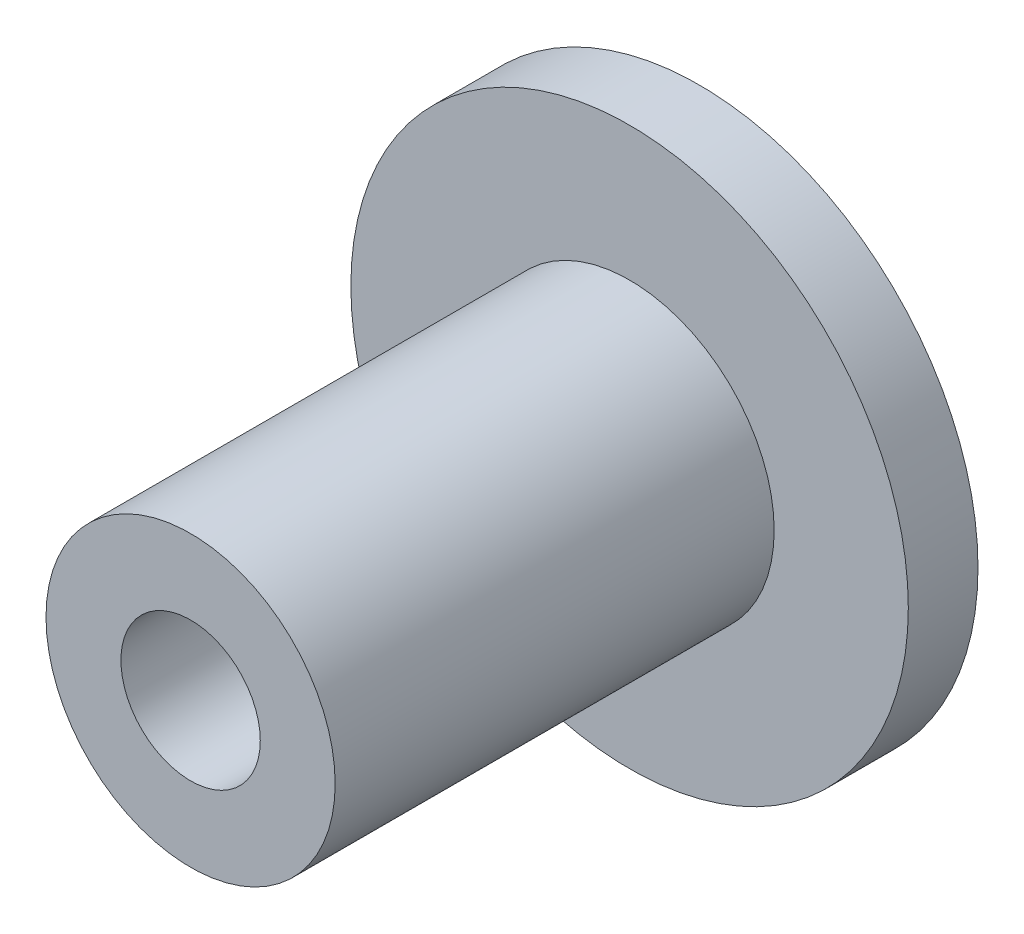
ISO-10303-21;
HEADER;
FILE_DESCRIPTION(('STEP AP214'),'2;1');
FILE_NAME('part.step','',(''),(''),'','','');
FILE_SCHEMA(('AUTOMOTIVE_DESIGN { 1 0 10303 214 1 1 1 1 }'));
ENDSEC;
DATA;
#1=APPLICATION_CONTEXT('core data for automotive mechanical design processes');
#2=APPLICATION_PROTOCOL_DEFINITION('international standard','automotive_design',2000,#1);
#3=PRODUCT_CONTEXT('',#1,'mechanical');
#4=PRODUCT('Part','Part','',(#3));
#5=PRODUCT_RELATED_PRODUCT_CATEGORY('part','',(#4));
#6=PRODUCT_DEFINITION_FORMATION('','',#4);
#7=PRODUCT_DEFINITION_CONTEXT('part definition',#1,'design');
#8=PRODUCT_DEFINITION('design','',#6,#7);
#9=PRODUCT_DEFINITION_SHAPE('','',#8);
#10=(LENGTH_UNIT() NAMED_UNIT(*) SI_UNIT(.MILLI.,.METRE.));
#11=(NAMED_UNIT(*) PLANE_ANGLE_UNIT() SI_UNIT($,.RADIAN.));
#12=(NAMED_UNIT(*) SI_UNIT($,.STERADIAN.) SOLID_ANGLE_UNIT());
#13=UNCERTAINTY_MEASURE_WITH_UNIT(LENGTH_MEASURE(1.E-05),#10,'distance_accuracy_value','');
#14=(GEOMETRIC_REPRESENTATION_CONTEXT(3) GLOBAL_UNCERTAINTY_ASSIGNED_CONTEXT((#13)) GLOBAL_UNIT_ASSIGNED_CONTEXT((#10,
#11,#12)) REPRESENTATION_CONTEXT('',''));
#15=CARTESIAN_POINT('',(0.,0.,0.));
#16=DIRECTION('',(0.,0.,1.));
#17=DIRECTION('',(1.,0.,0.));
#18=AXIS2_PLACEMENT_3D('',#15,#16,#17);
#19=CARTESIAN_POINT('',(0.,0.,0.5));
#20=DIRECTION('',(0.,0.,-1.));
#21=DIRECTION('',(-1.,0.,0.));
#22=AXIS2_PLACEMENT_3D('',#19,#20,#21);
#23=CYLINDRICAL_SURFACE('',#22,4.);
#24=CARTESIAN_POINT('',(0.,0.,0.5));
#25=DIRECTION('',(0.,0.,1.));
#26=DIRECTION('',(1.,0.,0.));
#27=AXIS2_PLACEMENT_3D('',#24,#25,#26);
#28=CIRCLE('',#27,4.);
#29=CARTESIAN_POINT('',(4.,0.,0.5));
#30=VERTEX_POINT('',#29);
#31=EDGE_CURVE('E48',#30,#30,#28,.T.);
#32=ORIENTED_EDGE('',*,*,#31,.F.);
#33=EDGE_LOOP('',(#32));
#34=FACE_BOUND('',#33,.T.);
#35=CARTESIAN_POINT('',(0.,0.,-0.5));
#36=DIRECTION('',(0.,0.,1.));
#37=DIRECTION('',(1.,0.,0.));
#38=AXIS2_PLACEMENT_3D('',#35,#36,#37);
#39=CIRCLE('',#38,4.);
#40=CARTESIAN_POINT('',(4.,0.,-0.5));
#41=VERTEX_POINT('',#40);
#42=EDGE_CURVE('E44',#41,#41,#39,.T.);
#43=ORIENTED_EDGE('',*,*,#42,.T.);
#44=EDGE_LOOP('',(#43));
#45=FACE_BOUND('',#44,.T.);
#46=ADVANCED_FACE('F41',(#34,#45),#23,.T.);
#47=CARTESIAN_POINT('',(0.,0.,0.5));
#48=DIRECTION('',(0.,0.,1.));
#49=DIRECTION('',(1.,0.,0.));
#50=AXIS2_PLACEMENT_3D('',#47,#48,#49);
#51=PLANE('',#50);
#52=CARTESIAN_POINT('',(0.,0.,0.5));
#53=DIRECTION('',(0.,0.,1.));
#54=DIRECTION('',(1.,0.,0.));
#55=AXIS2_PLACEMENT_3D('',#52,#53,#54);
#56=CIRCLE('',#55,2.075);
#57=CARTESIAN_POINT('',(2.075,0.,0.5));
#58=VERTEX_POINT('',#57);
#59=EDGE_CURVE('E10',#58,#58,#56,.T.);
#60=ORIENTED_EDGE('',*,*,#59,.F.);
#61=EDGE_LOOP('',(#60));
#62=FACE_BOUND('',#61,.T.);
#63=ORIENTED_EDGE('',*,*,#31,.T.);
#64=EDGE_LOOP('',(#63));
#65=FACE_BOUND('',#64,.T.);
#66=ADVANCED_FACE('F86',(#62,#65),#51,.T.);
#67=CARTESIAN_POINT('',(0.,0.,-0.5));
#68=DIRECTION('',(0.,0.,1.));
#69=DIRECTION('',(1.,0.,0.));
#70=AXIS2_PLACEMENT_3D('',#67,#68,#69);
#71=PLANE('',#70);
#72=CARTESIAN_POINT('',(0.,0.,-0.5));
#73=DIRECTION('',(0.,0.,1.));
#74=DIRECTION('',(1.,0.,0.));
#75=AXIS2_PLACEMENT_3D('',#72,#73,#74);
#76=CIRCLE('',#75,1.);
#77=CARTESIAN_POINT('',(1.,0.,-0.500000000000001));
#78=VERTEX_POINT('',#77);
#79=EDGE_CURVE('E57',#78,#78,#76,.T.);
#80=ORIENTED_EDGE('',*,*,#79,.T.);
#81=EDGE_LOOP('',(#80));
#82=FACE_BOUND('',#81,.T.);
#83=ORIENTED_EDGE('',*,*,#42,.F.);
#84=EDGE_LOOP('',(#83));
#85=FACE_BOUND('',#84,.T.);
#86=ADVANCED_FACE('F64',(#82,#85),#71,.F.);
#87=CARTESIAN_POINT('',(0.,0.,6.8));
#88=DIRECTION('',(0.,0.,-1.));
#89=DIRECTION('',(-1.,0.,0.));
#90=AXIS2_PLACEMENT_3D('',#87,#88,#89);
#91=CYLINDRICAL_SURFACE('',#90,2.075);
#92=CARTESIAN_POINT('',(0.,0.,6.8));
#93=DIRECTION('',(0.,0.,1.));
#94=DIRECTION('',(1.,0.,0.));
#95=AXIS2_PLACEMENT_3D('',#92,#93,#94);
#96=CIRCLE('',#95,2.075);
#97=CARTESIAN_POINT('',(2.075,0.,6.8));
#98=VERTEX_POINT('',#97);
#99=EDGE_CURVE('E54',#98,#98,#96,.T.);
#100=ORIENTED_EDGE('',*,*,#99,.F.);
#101=EDGE_LOOP('',(#100));
#102=FACE_BOUND('',#101,.T.);
#103=ORIENTED_EDGE('',*,*,#59,.T.);
#104=EDGE_LOOP('',(#103));
#105=FACE_BOUND('',#104,.T.);
#106=ADVANCED_FACE('F76',(#102,#105),#91,.T.);
#107=CARTESIAN_POINT('',(0.,0.,6.8));
#108=DIRECTION('',(0.,0.,1.));
#109=DIRECTION('',(1.,0.,0.));
#110=AXIS2_PLACEMENT_3D('',#107,#108,#109);
#111=PLANE('',#110);
#112=CARTESIAN_POINT('',(0.,0.,6.8));
#113=DIRECTION('',(0.,0.,1.));
#114=DIRECTION('',(1.,0.,0.));
#115=AXIS2_PLACEMENT_3D('',#112,#113,#114);
#116=CIRCLE('',#115,1.);
#117=CARTESIAN_POINT('',(1.,0.,6.8));
#118=VERTEX_POINT('',#117);
#119=EDGE_CURVE('E58',#118,#118,#116,.T.);
#120=ORIENTED_EDGE('',*,*,#119,.F.);
#121=EDGE_LOOP('',(#120));
#122=FACE_BOUND('',#121,.T.);
#123=ORIENTED_EDGE('',*,*,#99,.T.);
#124=EDGE_LOOP('',(#123));
#125=FACE_BOUND('',#124,.T.);
#126=ADVANCED_FACE('F70',(#122,#125),#111,.T.);
#127=CARTESIAN_POINT('',(0.,0.,-0.5));
#128=DIRECTION('',(0.,0.,1.));
#129=DIRECTION('',(1.,0.,0.));
#130=AXIS2_PLACEMENT_3D('',#127,#128,#129);
#131=CYLINDRICAL_SURFACE('',#130,1.);
#132=CARTESIAN_POINT('',(1.,0.,-0.500000000000001));
#133=CARTESIAN_POINT('',(1.,0.,-0.423958333333334));
#134=CARTESIAN_POINT('',(1.,0.,-0.347916666666667));
#135=CARTESIAN_POINT('',(1.,0.,-0.195833333333334));
#136=CARTESIAN_POINT('',(1.,0.,-0.119791666666667));
#137=CARTESIAN_POINT('',(1.,0.,0.0322916666666661));
#138=CARTESIAN_POINT('',(1.,0.,0.108333333333333));
#139=CARTESIAN_POINT('',(1.,0.,0.260416666666666));
#140=CARTESIAN_POINT('',(1.,0.,0.336458333333333));
#141=CARTESIAN_POINT('',(1.,0.,0.488541666666666));
#142=CARTESIAN_POINT('',(1.,0.,0.564583333333333));
#143=CARTESIAN_POINT('',(1.,0.,0.716666666666666));
#144=CARTESIAN_POINT('',(1.,0.,0.792708333333333));
#145=CARTESIAN_POINT('',(1.,0.,0.944791666666666));
#146=CARTESIAN_POINT('',(1.,0.,1.02083333333333));
#147=CARTESIAN_POINT('',(1.,0.,1.17291666666667));
#148=CARTESIAN_POINT('',(1.,0.,1.24895833333333));
#149=CARTESIAN_POINT('',(1.,0.,1.40104166666667));
#150=CARTESIAN_POINT('',(1.,0.,1.47708333333333));
#151=CARTESIAN_POINT('',(1.,0.,1.62916666666667));
#152=CARTESIAN_POINT('',(1.,0.,1.70520833333333));
#153=CARTESIAN_POINT('',(1.,0.,1.85729166666667));
#154=CARTESIAN_POINT('',(1.,0.,1.93333333333333));
#155=CARTESIAN_POINT('',(1.,0.,2.08541666666667));
#156=CARTESIAN_POINT('',(1.,0.,2.16145833333333));
#157=CARTESIAN_POINT('',(1.,0.,2.31354166666667));
#158=CARTESIAN_POINT('',(1.,0.,2.38958333333333));
#159=CARTESIAN_POINT('',(1.,0.,2.54166666666667));
#160=CARTESIAN_POINT('',(1.,0.,2.61770833333333));
#161=CARTESIAN_POINT('',(1.,0.,2.76979166666667));
#162=CARTESIAN_POINT('',(1.,0.,2.84583333333333));
#163=CARTESIAN_POINT('',(1.,0.,2.99791666666667));
#164=CARTESIAN_POINT('',(1.,0.,3.07395833333333));
#165=CARTESIAN_POINT('',(1.,0.,3.22604166666667));
#166=CARTESIAN_POINT('',(1.,0.,3.30208333333333));
#167=CARTESIAN_POINT('',(1.,0.,3.45416666666667));
#168=CARTESIAN_POINT('',(1.,0.,3.53020833333333));
#169=CARTESIAN_POINT('',(1.,0.,3.68229166666667));
#170=CARTESIAN_POINT('',(1.,0.,3.75833333333333));
#171=CARTESIAN_POINT('',(1.,0.,3.91041666666667));
#172=CARTESIAN_POINT('',(1.,0.,3.98645833333333));
#173=CARTESIAN_POINT('',(1.,0.,4.13854166666667));
#174=CARTESIAN_POINT('',(1.,0.,4.21458333333333));
#175=CARTESIAN_POINT('',(1.,0.,4.36666666666667));
#176=CARTESIAN_POINT('',(1.,0.,4.44270833333333));
#177=CARTESIAN_POINT('',(1.,0.,4.59479166666667));
#178=CARTESIAN_POINT('',(1.,0.,4.67083333333333));
#179=CARTESIAN_POINT('',(1.,0.,4.82291666666667));
#180=CARTESIAN_POINT('',(1.,0.,4.89895833333333));
#181=CARTESIAN_POINT('',(1.,0.,5.05104166666667));
#182=CARTESIAN_POINT('',(1.,0.,5.12708333333333));
#183=CARTESIAN_POINT('',(1.,0.,5.27916666666667));
#184=CARTESIAN_POINT('',(1.,0.,5.35520833333333));
#185=CARTESIAN_POINT('',(1.,0.,5.50729166666667));
#186=CARTESIAN_POINT('',(1.,0.,5.58333333333333));
#187=CARTESIAN_POINT('',(1.,0.,5.73541666666667));
#188=CARTESIAN_POINT('',(1.,0.,5.81145833333333));
#189=CARTESIAN_POINT('',(1.,0.,5.96354166666667));
#190=CARTESIAN_POINT('',(1.,0.,6.03958333333333));
#191=CARTESIAN_POINT('',(1.,0.,6.19166666666667));
#192=CARTESIAN_POINT('',(1.,0.,6.26770833333333));
#193=CARTESIAN_POINT('',(1.,0.,6.41979166666667));
#194=CARTESIAN_POINT('',(1.,0.,6.49583333333333));
#195=CARTESIAN_POINT('',(1.,0.,6.64791666666667));
#196=CARTESIAN_POINT('',(1.,0.,6.72395833333333));
#197=CARTESIAN_POINT('',(1.,0.,6.8));
#198=B_SPLINE_CURVE_WITH_KNOTS('',3,(#132,#133,#134,#135,#136,#137,#138,#139,#140,#141,#142,
#143,#144,#145,#146,#147,#148,#149,#150,#151,#152,#153,#154,#155,#156,#157,#158,#159,#160,#161,
#162,#163,#164,#165,#166,#167,#168,#169,#170,#171,#172,#173,#174,#175,#176,#177,#178,#179,#180,
#181,#182,#183,#184,#185,#186,#187,#188,#189,#190,#191,#192,#193,#194,#195,#196,#197),
.UNSPECIFIED.,.F.,.F.,(4,2,2,2,2,2,2,2,2,2,2,2,2,2,2,2,2,2,2,2,2,2,2,2,2,2,2,2,2,2,2,2,4),(0.,
0.228125,0.45625,0.684375,0.9125,1.140625,1.36875,1.596875,1.825,2.053125,2.28125,2.509375,
2.7375,2.965625,3.19375,3.421875,3.65,3.878125,4.10625,4.334375,4.5625,4.790625,5.01875,
5.246875,5.475,5.703125,5.93125,6.159375,6.3875,6.615625,6.84375,7.071875,7.3),.UNSPECIFIED.);
#199=EDGE_CURVE('BSEAM67',#78,#118,#198,.T.);
#200=ORIENTED_EDGE('',*,*,#79,.F.);
#201=ORIENTED_EDGE('',*,*,#119,.T.);
#202=ORIENTED_EDGE('',*,*,#199,.T.);
#203=ORIENTED_EDGE('',*,*,#199,.F.);
#204=EDGE_LOOP('',(#200,#202,#201,#203));
#205=FACE_BOUND('',#204,.T.);
#206=ADVANCED_FACE('F67',(#205),#131,.F.);
#207=CLOSED_SHELL('',(#46,#66,#86,#106,#126,#206));
#208=MANIFOLD_SOLID_BREP('B2',#207);
#209=ADVANCED_BREP_SHAPE_REPRESENTATION('',(#18,#208),#14);
#210=SHAPE_DEFINITION_REPRESENTATION(#9,#209);
ENDSEC;
END-ISO-10303-21;
